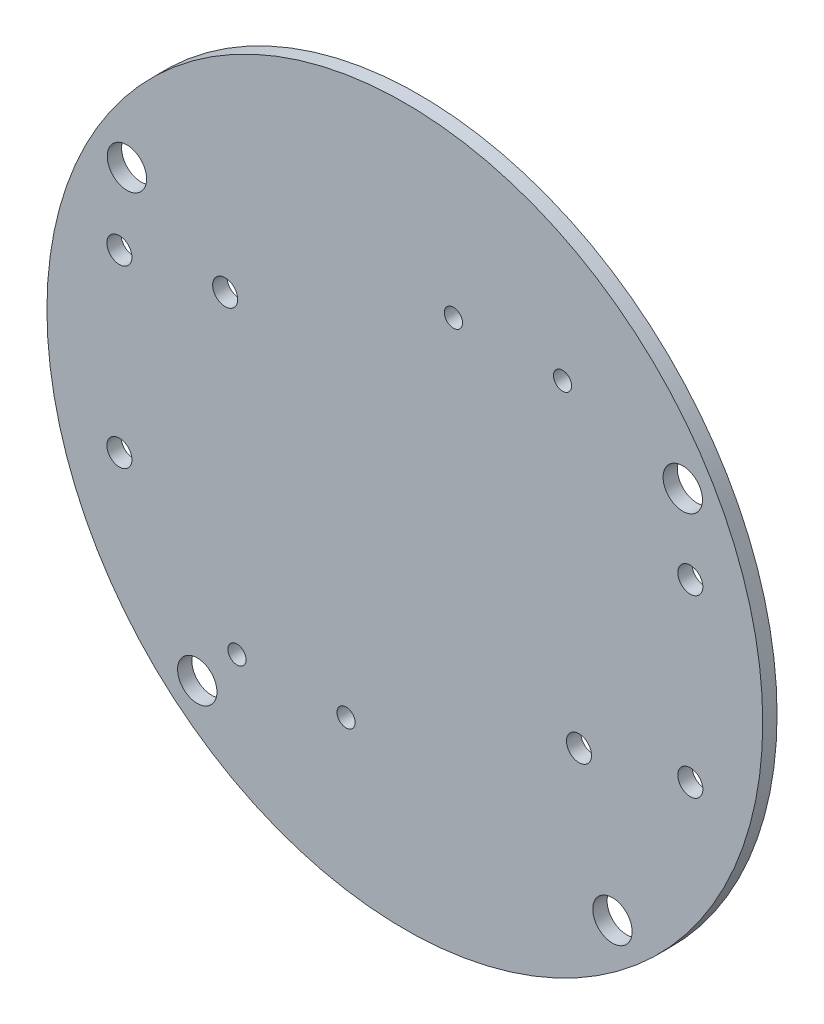
ISO-10303-21;
HEADER;
FILE_DESCRIPTION(('STEP AP214'),'2;1');
FILE_NAME('part.step','',(''),(''),'','','');
FILE_SCHEMA(('AUTOMOTIVE_DESIGN { 1 0 10303 214 1 1 1 1 }'));
ENDSEC;
DATA;
#1=APPLICATION_CONTEXT('core data for automotive mechanical design processes');
#2=APPLICATION_PROTOCOL_DEFINITION('international standard','automotive_design',2000,#1);
#3=PRODUCT_CONTEXT('',#1,'mechanical');
#4=PRODUCT('Part','Part','',(#3));
#5=PRODUCT_RELATED_PRODUCT_CATEGORY('part','',(#4));
#6=PRODUCT_DEFINITION_FORMATION('','',#4);
#7=PRODUCT_DEFINITION_CONTEXT('part definition',#1,'design');
#8=PRODUCT_DEFINITION('design','',#6,#7);
#9=PRODUCT_DEFINITION_SHAPE('','',#8);
#10=(LENGTH_UNIT() NAMED_UNIT(*) SI_UNIT(.MILLI.,.METRE.));
#11=(NAMED_UNIT(*) PLANE_ANGLE_UNIT() SI_UNIT($,.RADIAN.));
#12=(NAMED_UNIT(*) SI_UNIT($,.STERADIAN.) SOLID_ANGLE_UNIT());
#13=UNCERTAINTY_MEASURE_WITH_UNIT(LENGTH_MEASURE(1.E-05),#10,'distance_accuracy_value','');
#14=(GEOMETRIC_REPRESENTATION_CONTEXT(3) GLOBAL_UNCERTAINTY_ASSIGNED_CONTEXT((#13)) GLOBAL_UNIT_ASSIGNED_CONTEXT((#10,
#11,#12)) REPRESENTATION_CONTEXT('',''));
#15=CARTESIAN_POINT('',(0.,0.,0.));
#16=DIRECTION('',(0.,0.,1.));
#17=DIRECTION('',(1.,0.,0.));
#18=AXIS2_PLACEMENT_3D('',#15,#16,#17);
#19=CARTESIAN_POINT('',(0.,0.,2.));
#20=DIRECTION('',(0.,0.,-1.));
#21=DIRECTION('',(-1.,0.,0.));
#22=AXIS2_PLACEMENT_3D('',#19,#20,#21);
#23=CYLINDRICAL_SURFACE('',#22,50.);
#24=CARTESIAN_POINT('',(0.,0.,2.));
#25=DIRECTION('',(0.,0.,1.));
#26=DIRECTION('',(1.,0.,0.));
#27=AXIS2_PLACEMENT_3D('',#24,#25,#26);
#28=CIRCLE('',#27,50.);
#29=CARTESIAN_POINT('',(50.,0.,2.));
#30=VERTEX_POINT('',#29);
#31=EDGE_CURVE('E10',#30,#30,#28,.T.);
#32=ORIENTED_EDGE('',*,*,#31,.F.);
#33=EDGE_LOOP('',(#32));
#34=FACE_BOUND('',#33,.T.);
#35=CARTESIAN_POINT('',(0.,0.,0.));
#36=DIRECTION('',(0.,0.,1.));
#37=DIRECTION('',(1.,0.,0.));
#38=AXIS2_PLACEMENT_3D('',#35,#36,#37);
#39=CIRCLE('',#38,50.);
#40=CARTESIAN_POINT('',(50.,0.,0.));
#41=VERTEX_POINT('',#40);
#42=EDGE_CURVE('E47',#41,#41,#39,.T.);
#43=ORIENTED_EDGE('',*,*,#42,.T.);
#44=EDGE_LOOP('',(#43));
#45=FACE_BOUND('',#44,.T.);
#46=ADVANCED_FACE('F39',(#34,#45),#23,.T.);
#47=CARTESIAN_POINT('',(0.,0.,2.));
#48=DIRECTION('',(0.,0.,1.));
#49=DIRECTION('',(1.,0.,0.));
#50=AXIS2_PLACEMENT_3D('',#47,#48,#49);
#51=PLANE('',#50);
#52=CARTESIAN_POINT('',(39.88,-12.25,2.));
#53=DIRECTION('',(0.,0.,1.));
#54=DIRECTION('',(1.,0.,0.));
#55=AXIS2_PLACEMENT_3D('',#52,#53,#54);
#56=CIRCLE('',#55,1.75);
#57=CARTESIAN_POINT('',(41.63,-12.25,2.));
#58=VERTEX_POINT('',#57);
#59=EDGE_CURVE('E264',#58,#58,#56,.T.);
#60=ORIENTED_EDGE('',*,*,#59,.F.);
#61=EDGE_LOOP('',(#60));
#62=FACE_BOUND('',#61,.T.);
#63=CARTESIAN_POINT('',(6.79000000000002,27.4,2.));
#64=DIRECTION('',(0.,0.,1.));
#65=DIRECTION('',(1.,0.,0.));
#66=AXIS2_PLACEMENT_3D('',#63,#64,#65);
#67=CIRCLE('',#66,1.27);
#68=CARTESIAN_POINT('',(8.06000000000002,27.4,2.));
#69=VERTEX_POINT('',#68);
#70=EDGE_CURVE('E258',#69,#69,#67,.T.);
#71=ORIENTED_EDGE('',*,*,#70,.F.);
#72=EDGE_LOOP('',(#71));
#73=FACE_BOUND('',#72,.T.);
#74=CARTESIAN_POINT('',(22.03,27.4,2.));
#75=DIRECTION('',(0.,0.,1.));
#76=DIRECTION('',(1.,0.,0.));
#77=AXIS2_PLACEMENT_3D('',#74,#75,#76);
#78=CIRCLE('',#77,1.27);
#79=CARTESIAN_POINT('',(23.3,27.4,2.));
#80=VERTEX_POINT('',#79);
#81=EDGE_CURVE('E233',#80,#80,#78,.T.);
#82=ORIENTED_EDGE('',*,*,#81,.F.);
#83=EDGE_LOOP('',(#82));
#84=FACE_BOUND('',#83,.T.);
#85=CARTESIAN_POINT('',(-8.20999999999998,-28.46,2.));
#86=DIRECTION('',(0.,0.,1.));
#87=DIRECTION('',(1.,0.,0.));
#88=AXIS2_PLACEMENT_3D('',#85,#86,#87);
#89=CIRCLE('',#88,1.27);
#90=CARTESIAN_POINT('',(-6.93999999999998,-28.46,2.));
#91=VERTEX_POINT('',#90);
#92=EDGE_CURVE('E259',#91,#91,#89,.T.);
#93=ORIENTED_EDGE('',*,*,#92,.F.);
#94=EDGE_LOOP('',(#93));
#95=FACE_BOUND('',#94,.T.);
#96=CARTESIAN_POINT('',(39.88,12.25,2.));
#97=DIRECTION('',(0.,0.,1.));
#98=DIRECTION('',(1.,0.,0.));
#99=AXIS2_PLACEMENT_3D('',#96,#97,#98);
#100=CIRCLE('',#99,1.75);
#101=CARTESIAN_POINT('',(41.63,12.25,2.));
#102=VERTEX_POINT('',#101);
#103=EDGE_CURVE('E273',#102,#102,#100,.T.);
#104=ORIENTED_EDGE('',*,*,#103,.F.);
#105=EDGE_LOOP('',(#104));
#106=FACE_BOUND('',#105,.T.);
#107=CARTESIAN_POINT('',(-39.88,12.25,2.));
#108=DIRECTION('',(0.,0.,1.));
#109=DIRECTION('',(1.,0.,0.));
#110=AXIS2_PLACEMENT_3D('',#107,#108,#109);
#111=CIRCLE('',#110,1.75);
#112=CARTESIAN_POINT('',(-38.13,12.25,2.));
#113=VERTEX_POINT('',#112);
#114=EDGE_CURVE('E283',#113,#113,#111,.T.);
#115=ORIENTED_EDGE('',*,*,#114,.F.);
#116=EDGE_LOOP('',(#115));
#117=FACE_BOUND('',#116,.T.);
#118=CARTESIAN_POINT('',(-39.88,-12.25,2.));
#119=DIRECTION('',(0.,0.,1.));
#120=DIRECTION('',(1.,0.,0.));
#121=AXIS2_PLACEMENT_3D('',#118,#119,#120);
#122=CIRCLE('',#121,1.75);
#123=CARTESIAN_POINT('',(-38.13,-12.25,2.));
#124=VERTEX_POINT('',#123);
#125=EDGE_CURVE('E279',#124,#124,#122,.T.);
#126=ORIENTED_EDGE('',*,*,#125,.F.);
#127=EDGE_LOOP('',(#126));
#128=FACE_BOUND('',#127,.T.);
#129=CARTESIAN_POINT('',(24.33,-15.91,2.));
#130=DIRECTION('',(0.,0.,1.));
#131=DIRECTION('',(1.,0.,0.));
#132=AXIS2_PLACEMENT_3D('',#129,#130,#131);
#133=CIRCLE('',#132,1.75);
#134=CARTESIAN_POINT('',(26.08,-15.91,2.));
#135=VERTEX_POINT('',#134);
#136=EDGE_CURVE('E275',#135,#135,#133,.T.);
#137=ORIENTED_EDGE('',*,*,#136,.F.);
#138=EDGE_LOOP('',(#137));
#139=FACE_BOUND('',#138,.T.);
#140=CARTESIAN_POINT('',(-23.45,-28.46,2.));
#141=DIRECTION('',(0.,0.,1.));
#142=DIRECTION('',(1.,0.,0.));
#143=AXIS2_PLACEMENT_3D('',#140,#141,#142);
#144=CIRCLE('',#143,1.27);
#145=CARTESIAN_POINT('',(-22.18,-28.46,2.));
#146=VERTEX_POINT('',#145);
#147=EDGE_CURVE('E267',#146,#146,#144,.T.);
#148=ORIENTED_EDGE('',*,*,#147,.F.);
#149=EDGE_LOOP('',(#148));
#150=FACE_BOUND('',#149,.T.);
#151=CARTESIAN_POINT('',(-25.1,14.54,2.));
#152=DIRECTION('',(0.,0.,1.));
#153=DIRECTION('',(1.,0.,0.));
#154=AXIS2_PLACEMENT_3D('',#151,#152,#153);
#155=CIRCLE('',#154,1.75);
#156=CARTESIAN_POINT('',(-23.35,14.54,2.));
#157=VERTEX_POINT('',#156);
#158=EDGE_CURVE('E64',#157,#157,#155,.T.);
#159=ORIENTED_EDGE('',*,*,#158,.F.);
#160=EDGE_LOOP('',(#159));
#161=FACE_BOUND('',#160,.T.);
#162=CARTESIAN_POINT('',(38.8241975308642,22.7526193235952,2.));
#163=DIRECTION('',(0.,0.,1.));
#164=DIRECTION('',(1.,0.,0.));
#165=AXIS2_PLACEMENT_3D('',#162,#163,#164);
#166=CIRCLE('',#165,2.75);
#167=CARTESIAN_POINT('',(41.5741975308642,22.7526193235952,2.));
#168=VERTEX_POINT('',#167);
#169=EDGE_CURVE('E98',#168,#168,#166,.T.);
#170=ORIENTED_EDGE('',*,*,#169,.F.);
#171=EDGE_LOOP('',(#170));
#172=FACE_BOUND('',#171,.T.);
#173=CARTESIAN_POINT('',(-38.8241975308642,22.7526193235952,2.));
#174=DIRECTION('',(0.,0.,1.));
#175=DIRECTION('',(1.,0.,0.));
#176=AXIS2_PLACEMENT_3D('',#173,#174,#175);
#177=CIRCLE('',#176,2.75);
#178=CARTESIAN_POINT('',(-36.0741975308642,22.7526193235952,2.));
#179=VERTEX_POINT('',#178);
#180=EDGE_CURVE('E109',#179,#179,#177,.T.);
#181=ORIENTED_EDGE('',*,*,#180,.F.);
#182=EDGE_LOOP('',(#181));
#183=FACE_BOUND('',#182,.T.);
#184=CARTESIAN_POINT('',(29.,-34.4093010681705,2.));
#185=DIRECTION('',(0.,0.,1.));
#186=DIRECTION('',(1.,0.,0.));
#187=AXIS2_PLACEMENT_3D('',#184,#185,#186);
#188=CIRCLE('',#187,2.75);
#189=CARTESIAN_POINT('',(31.75,-34.4093010681705,2.));
#190=VERTEX_POINT('',#189);
#191=EDGE_CURVE('E123',#190,#190,#188,.T.);
#192=ORIENTED_EDGE('',*,*,#191,.F.);
#193=EDGE_LOOP('',(#192));
#194=FACE_BOUND('',#193,.T.);
#195=CARTESIAN_POINT('',(-29.,-34.4093010681705,2.));
#196=DIRECTION('',(0.,0.,1.));
#197=DIRECTION('',(1.,0.,0.));
#198=AXIS2_PLACEMENT_3D('',#195,#196,#197);
#199=CIRCLE('',#198,2.75);
#200=CARTESIAN_POINT('',(-26.25,-34.4093010681705,2.));
#201=VERTEX_POINT('',#200);
#202=EDGE_CURVE('E56',#201,#201,#199,.T.);
#203=ORIENTED_EDGE('',*,*,#202,.F.);
#204=EDGE_LOOP('',(#203));
#205=FACE_BOUND('',#204,.T.);
#206=ORIENTED_EDGE('',*,*,#31,.T.);
#207=EDGE_LOOP('',(#206));
#208=FACE_BOUND('',#207,.T.);
#209=ADVANCED_FACE('F142',(#62,#73,#84,#95,#106,#117,#128,#139,#150,#161,#172,#183,#194,#205,
#208),#51,.T.);
#210=CARTESIAN_POINT('',(0.,0.,0.));
#211=DIRECTION('',(0.,0.,1.));
#212=DIRECTION('',(1.,0.,0.));
#213=AXIS2_PLACEMENT_3D('',#210,#211,#212);
#214=PLANE('',#213);
#215=CARTESIAN_POINT('',(39.88,-12.25,0.));
#216=DIRECTION('',(0.,0.,1.));
#217=DIRECTION('',(1.,0.,0.));
#218=AXIS2_PLACEMENT_3D('',#215,#216,#217);
#219=CIRCLE('',#218,1.75);
#220=CARTESIAN_POINT('',(41.63,-12.25,0.));
#221=VERTEX_POINT('',#220);
#222=EDGE_CURVE('E42',#221,#221,#219,.T.);
#223=ORIENTED_EDGE('',*,*,#222,.T.);
#224=EDGE_LOOP('',(#223));
#225=FACE_BOUND('',#224,.T.);
#226=CARTESIAN_POINT('',(6.79000000000002,27.4,0.));
#227=DIRECTION('',(0.,0.,1.));
#228=DIRECTION('',(1.,0.,0.));
#229=AXIS2_PLACEMENT_3D('',#226,#227,#228);
#230=CIRCLE('',#229,1.27);
#231=CARTESIAN_POINT('',(8.06000000000002,27.4,0.));
#232=VERTEX_POINT('',#231);
#233=EDGE_CURVE('E91',#232,#232,#230,.T.);
#234=ORIENTED_EDGE('',*,*,#233,.T.);
#235=EDGE_LOOP('',(#234));
#236=FACE_BOUND('',#235,.T.);
#237=CARTESIAN_POINT('',(22.03,27.4,0.));
#238=DIRECTION('',(0.,0.,1.));
#239=DIRECTION('',(1.,0.,0.));
#240=AXIS2_PLACEMENT_3D('',#237,#238,#239);
#241=CIRCLE('',#240,1.27);
#242=CARTESIAN_POINT('',(23.3,27.4,0.));
#243=VERTEX_POINT('',#242);
#244=EDGE_CURVE('E88',#243,#243,#241,.T.);
#245=ORIENTED_EDGE('',*,*,#244,.T.);
#246=EDGE_LOOP('',(#245));
#247=FACE_BOUND('',#246,.T.);
#248=CARTESIAN_POINT('',(-8.20999999999998,-28.46,0.));
#249=DIRECTION('',(0.,0.,1.));
#250=DIRECTION('',(1.,0.,0.));
#251=AXIS2_PLACEMENT_3D('',#248,#249,#250);
#252=CIRCLE('',#251,1.27);
#253=CARTESIAN_POINT('',(-6.93999999999998,-28.46,0.));
#254=VERTEX_POINT('',#253);
#255=EDGE_CURVE('E84',#254,#254,#252,.T.);
#256=ORIENTED_EDGE('',*,*,#255,.T.);
#257=EDGE_LOOP('',(#256));
#258=FACE_BOUND('',#257,.T.);
#259=CARTESIAN_POINT('',(39.88,12.25,0.));
#260=DIRECTION('',(0.,0.,1.));
#261=DIRECTION('',(1.,0.,0.));
#262=AXIS2_PLACEMENT_3D('',#259,#260,#261);
#263=CIRCLE('',#262,1.75);
#264=CARTESIAN_POINT('',(41.63,12.25,0.));
#265=VERTEX_POINT('',#264);
#266=EDGE_CURVE('E80',#265,#265,#263,.T.);
#267=ORIENTED_EDGE('',*,*,#266,.T.);
#268=EDGE_LOOP('',(#267));
#269=FACE_BOUND('',#268,.T.);
#270=CARTESIAN_POINT('',(-39.88,12.25,0.));
#271=DIRECTION('',(0.,0.,1.));
#272=DIRECTION('',(1.,0.,0.));
#273=AXIS2_PLACEMENT_3D('',#270,#271,#272);
#274=CIRCLE('',#273,1.75);
#275=CARTESIAN_POINT('',(-38.13,12.25,0.));
#276=VERTEX_POINT('',#275);
#277=EDGE_CURVE('E76',#276,#276,#274,.T.);
#278=ORIENTED_EDGE('',*,*,#277,.T.);
#279=EDGE_LOOP('',(#278));
#280=FACE_BOUND('',#279,.T.);
#281=CARTESIAN_POINT('',(-39.88,-12.25,0.));
#282=DIRECTION('',(0.,0.,1.));
#283=DIRECTION('',(1.,0.,0.));
#284=AXIS2_PLACEMENT_3D('',#281,#282,#283);
#285=CIRCLE('',#284,1.75);
#286=CARTESIAN_POINT('',(-38.13,-12.25,0.));
#287=VERTEX_POINT('',#286);
#288=EDGE_CURVE('E72',#287,#287,#285,.T.);
#289=ORIENTED_EDGE('',*,*,#288,.T.);
#290=EDGE_LOOP('',(#289));
#291=FACE_BOUND('',#290,.T.);
#292=CARTESIAN_POINT('',(24.33,-15.91,0.));
#293=DIRECTION('',(0.,0.,1.));
#294=DIRECTION('',(1.,0.,0.));
#295=AXIS2_PLACEMENT_3D('',#292,#293,#294);
#296=CIRCLE('',#295,1.75);
#297=CARTESIAN_POINT('',(26.08,-15.91,0.));
#298=VERTEX_POINT('',#297);
#299=EDGE_CURVE('E68',#298,#298,#296,.T.);
#300=ORIENTED_EDGE('',*,*,#299,.T.);
#301=EDGE_LOOP('',(#300));
#302=FACE_BOUND('',#301,.T.);
#303=CARTESIAN_POINT('',(-23.45,-28.46,0.));
#304=DIRECTION('',(0.,0.,1.));
#305=DIRECTION('',(1.,0.,0.));
#306=AXIS2_PLACEMENT_3D('',#303,#304,#305);
#307=CIRCLE('',#306,1.27);
#308=CARTESIAN_POINT('',(-22.18,-28.46,0.));
#309=VERTEX_POINT('',#308);
#310=EDGE_CURVE('E63',#309,#309,#307,.T.);
#311=ORIENTED_EDGE('',*,*,#310,.T.);
#312=EDGE_LOOP('',(#311));
#313=FACE_BOUND('',#312,.T.);
#314=CARTESIAN_POINT('',(-25.1,14.54,0.));
#315=DIRECTION('',(0.,0.,1.));
#316=DIRECTION('',(1.,0.,0.));
#317=AXIS2_PLACEMENT_3D('',#314,#315,#316);
#318=CIRCLE('',#317,1.75);
#319=CARTESIAN_POINT('',(-23.35,14.54,0.));
#320=VERTEX_POINT('',#319);
#321=EDGE_CURVE('E59',#320,#320,#318,.T.);
#322=ORIENTED_EDGE('',*,*,#321,.T.);
#323=EDGE_LOOP('',(#322));
#324=FACE_BOUND('',#323,.T.);
#325=CARTESIAN_POINT('',(38.8241975308642,22.7526193235952,0.));
#326=DIRECTION('',(0.,0.,1.));
#327=DIRECTION('',(1.,0.,0.));
#328=AXIS2_PLACEMENT_3D('',#325,#326,#327);
#329=CIRCLE('',#328,2.75);
#330=CARTESIAN_POINT('',(41.5741975308642,22.7526193235952,0.));
#331=VERTEX_POINT('',#330);
#332=EDGE_CURVE('E103',#331,#331,#329,.T.);
#333=ORIENTED_EDGE('',*,*,#332,.T.);
#334=EDGE_LOOP('',(#333));
#335=FACE_BOUND('',#334,.T.);
#336=CARTESIAN_POINT('',(-38.8241975308642,22.7526193235952,0.));
#337=DIRECTION('',(0.,0.,1.));
#338=DIRECTION('',(1.,0.,0.));
#339=AXIS2_PLACEMENT_3D('',#336,#337,#338);
#340=CIRCLE('',#339,2.75);
#341=CARTESIAN_POINT('',(-36.0741975308642,22.7526193235952,0.));
#342=VERTEX_POINT('',#341);
#343=EDGE_CURVE('E129',#342,#342,#340,.T.);
#344=ORIENTED_EDGE('',*,*,#343,.T.);
#345=EDGE_LOOP('',(#344));
#346=FACE_BOUND('',#345,.T.);
#347=CARTESIAN_POINT('',(29.,-34.4093010681705,0.));
#348=DIRECTION('',(0.,0.,1.));
#349=DIRECTION('',(1.,0.,0.));
#350=AXIS2_PLACEMENT_3D('',#347,#348,#349);
#351=CIRCLE('',#350,2.75);
#352=CARTESIAN_POINT('',(31.75,-34.4093010681705,0.));
#353=VERTEX_POINT('',#352);
#354=EDGE_CURVE('E118',#353,#353,#351,.T.);
#355=ORIENTED_EDGE('',*,*,#354,.T.);
#356=EDGE_LOOP('',(#355));
#357=FACE_BOUND('',#356,.T.);
#358=CARTESIAN_POINT('',(-29.,-34.4093010681705,0.));
#359=DIRECTION('',(0.,0.,1.));
#360=DIRECTION('',(1.,0.,0.));
#361=AXIS2_PLACEMENT_3D('',#358,#359,#360);
#362=CIRCLE('',#361,2.75);
#363=CARTESIAN_POINT('',(-26.25,-34.4093010681705,0.));
#364=VERTEX_POINT('',#363);
#365=EDGE_CURVE('E53',#364,#364,#362,.T.);
#366=ORIENTED_EDGE('',*,*,#365,.T.);
#367=EDGE_LOOP('',(#366));
#368=FACE_BOUND('',#367,.T.);
#369=ORIENTED_EDGE('',*,*,#42,.F.);
#370=EDGE_LOOP('',(#369));
#371=FACE_BOUND('',#370,.T.);
#372=ADVANCED_FACE('F145',(#225,#236,#247,#258,#269,#280,#291,#302,#313,#324,#335,#346,#357,
#368,#371),#214,.F.);
#373=CARTESIAN_POINT('',(-29.,-34.4093010681705,0.));
#374=DIRECTION('',(0.,0.,1.));
#375=DIRECTION('',(1.,0.,0.));
#376=AXIS2_PLACEMENT_3D('',#373,#374,#375);
#377=CYLINDRICAL_SURFACE('',#376,2.75);
#378=ORIENTED_EDGE('',*,*,#365,.F.);
#379=EDGE_LOOP('',(#378));
#380=FACE_BOUND('',#379,.T.);
#381=ORIENTED_EDGE('',*,*,#202,.T.);
#382=EDGE_LOOP('',(#381));
#383=FACE_BOUND('',#382,.T.);
#384=ADVANCED_FACE('F153',(#380,#383),#377,.F.);
#385=CARTESIAN_POINT('',(29.,-34.4093010681705,0.));
#386=DIRECTION('',(0.,0.,1.));
#387=DIRECTION('',(1.,0.,0.));
#388=AXIS2_PLACEMENT_3D('',#385,#386,#387);
#389=CYLINDRICAL_SURFACE('',#388,2.75);
#390=ORIENTED_EDGE('',*,*,#354,.F.);
#391=EDGE_LOOP('',(#390));
#392=FACE_BOUND('',#391,.T.);
#393=ORIENTED_EDGE('',*,*,#191,.T.);
#394=EDGE_LOOP('',(#393));
#395=FACE_BOUND('',#394,.T.);
#396=ADVANCED_FACE('F151',(#392,#395),#389,.F.);
#397=CARTESIAN_POINT('',(-38.8241975308642,22.7526193235952,0.));
#398=DIRECTION('',(0.,0.,1.));
#399=DIRECTION('',(1.,0.,0.));
#400=AXIS2_PLACEMENT_3D('',#397,#398,#399);
#401=CYLINDRICAL_SURFACE('',#400,2.75);
#402=ORIENTED_EDGE('',*,*,#343,.F.);
#403=EDGE_LOOP('',(#402));
#404=FACE_BOUND('',#403,.T.);
#405=ORIENTED_EDGE('',*,*,#180,.T.);
#406=EDGE_LOOP('',(#405));
#407=FACE_BOUND('',#406,.T.);
#408=ADVANCED_FACE('F140',(#404,#407),#401,.F.);
#409=CARTESIAN_POINT('',(38.8241975308642,22.7526193235952,0.));
#410=DIRECTION('',(0.,0.,1.));
#411=DIRECTION('',(1.,0.,0.));
#412=AXIS2_PLACEMENT_3D('',#409,#410,#411);
#413=CYLINDRICAL_SURFACE('',#412,2.75);
#414=ORIENTED_EDGE('',*,*,#332,.F.);
#415=EDGE_LOOP('',(#414));
#416=FACE_BOUND('',#415,.T.);
#417=ORIENTED_EDGE('',*,*,#169,.T.);
#418=EDGE_LOOP('',(#417));
#419=FACE_BOUND('',#418,.T.);
#420=ADVANCED_FACE('F160',(#416,#419),#413,.F.);
#421=CARTESIAN_POINT('',(-25.1,14.54,-8.));
#422=DIRECTION('',(0.,0.,1.));
#423=DIRECTION('',(1.,0.,0.));
#424=AXIS2_PLACEMENT_3D('',#421,#422,#423);
#425=CYLINDRICAL_SURFACE('',#424,1.75);
#426=ORIENTED_EDGE('',*,*,#158,.T.);
#427=EDGE_LOOP('',(#426));
#428=FACE_BOUND('',#427,.T.);
#429=ORIENTED_EDGE('',*,*,#321,.F.);
#430=EDGE_LOOP('',(#429));
#431=FACE_BOUND('',#430,.T.);
#432=ADVANCED_FACE('F178',(#428,#431),#425,.F.);
#433=CARTESIAN_POINT('',(-23.45,-28.46,-8.));
#434=DIRECTION('',(0.,0.,1.));
#435=DIRECTION('',(1.,0.,0.));
#436=AXIS2_PLACEMENT_3D('',#433,#434,#435);
#437=CYLINDRICAL_SURFACE('',#436,1.27);
#438=ORIENTED_EDGE('',*,*,#147,.T.);
#439=EDGE_LOOP('',(#438));
#440=FACE_BOUND('',#439,.T.);
#441=ORIENTED_EDGE('',*,*,#310,.F.);
#442=EDGE_LOOP('',(#441));
#443=FACE_BOUND('',#442,.T.);
#444=ADVANCED_FACE('F183',(#440,#443),#437,.F.);
#445=CARTESIAN_POINT('',(24.33,-15.91,-8.));
#446=DIRECTION('',(0.,0.,1.));
#447=DIRECTION('',(1.,0.,0.));
#448=AXIS2_PLACEMENT_3D('',#445,#446,#447);
#449=CYLINDRICAL_SURFACE('',#448,1.75);
#450=ORIENTED_EDGE('',*,*,#136,.T.);
#451=EDGE_LOOP('',(#450));
#452=FACE_BOUND('',#451,.T.);
#453=ORIENTED_EDGE('',*,*,#299,.F.);
#454=EDGE_LOOP('',(#453));
#455=FACE_BOUND('',#454,.T.);
#456=ADVANCED_FACE('F192',(#452,#455),#449,.F.);
#457=CARTESIAN_POINT('',(-39.88,-12.25,-8.));
#458=DIRECTION('',(0.,0.,1.));
#459=DIRECTION('',(1.,0.,0.));
#460=AXIS2_PLACEMENT_3D('',#457,#458,#459);
#461=CYLINDRICAL_SURFACE('',#460,1.75);
#462=ORIENTED_EDGE('',*,*,#125,.T.);
#463=EDGE_LOOP('',(#462));
#464=FACE_BOUND('',#463,.T.);
#465=ORIENTED_EDGE('',*,*,#288,.F.);
#466=EDGE_LOOP('',(#465));
#467=FACE_BOUND('',#466,.T.);
#468=ADVANCED_FACE('F206',(#464,#467),#461,.F.);
#469=CARTESIAN_POINT('',(-39.88,12.25,-8.));
#470=DIRECTION('',(0.,0.,1.));
#471=DIRECTION('',(1.,0.,0.));
#472=AXIS2_PLACEMENT_3D('',#469,#470,#471);
#473=CYLINDRICAL_SURFACE('',#472,1.75);
#474=ORIENTED_EDGE('',*,*,#114,.T.);
#475=EDGE_LOOP('',(#474));
#476=FACE_BOUND('',#475,.T.);
#477=ORIENTED_EDGE('',*,*,#277,.F.);
#478=EDGE_LOOP('',(#477));
#479=FACE_BOUND('',#478,.T.);
#480=ADVANCED_FACE('F202',(#476,#479),#473,.F.);
#481=CARTESIAN_POINT('',(39.88,12.25,-8.));
#482=DIRECTION('',(0.,0.,1.));
#483=DIRECTION('',(1.,0.,0.));
#484=AXIS2_PLACEMENT_3D('',#481,#482,#483);
#485=CYLINDRICAL_SURFACE('',#484,1.75);
#486=ORIENTED_EDGE('',*,*,#103,.T.);
#487=EDGE_LOOP('',(#486));
#488=FACE_BOUND('',#487,.T.);
#489=ORIENTED_EDGE('',*,*,#266,.F.);
#490=EDGE_LOOP('',(#489));
#491=FACE_BOUND('',#490,.T.);
#492=ADVANCED_FACE('F198',(#488,#491),#485,.F.);
#493=CARTESIAN_POINT('',(-8.20999999999998,-28.46,-8.));
#494=DIRECTION('',(0.,0.,1.));
#495=DIRECTION('',(1.,0.,0.));
#496=AXIS2_PLACEMENT_3D('',#493,#494,#495);
#497=CYLINDRICAL_SURFACE('',#496,1.27);
#498=ORIENTED_EDGE('',*,*,#92,.T.);
#499=EDGE_LOOP('',(#498));
#500=FACE_BOUND('',#499,.T.);
#501=ORIENTED_EDGE('',*,*,#255,.F.);
#502=EDGE_LOOP('',(#501));
#503=FACE_BOUND('',#502,.T.);
#504=ADVANCED_FACE('F201',(#500,#503),#497,.F.);
#505=CARTESIAN_POINT('',(22.03,27.4,-8.));
#506=DIRECTION('',(0.,0.,1.));
#507=DIRECTION('',(1.,0.,0.));
#508=AXIS2_PLACEMENT_3D('',#505,#506,#507);
#509=CYLINDRICAL_SURFACE('',#508,1.27);
#510=ORIENTED_EDGE('',*,*,#81,.T.);
#511=EDGE_LOOP('',(#510));
#512=FACE_BOUND('',#511,.T.);
#513=ORIENTED_EDGE('',*,*,#244,.F.);
#514=EDGE_LOOP('',(#513));
#515=FACE_BOUND('',#514,.T.);
#516=ADVANCED_FACE('F218',(#512,#515),#509,.F.);
#517=CARTESIAN_POINT('',(6.79000000000002,27.4,-8.));
#518=DIRECTION('',(0.,0.,1.));
#519=DIRECTION('',(1.,0.,0.));
#520=AXIS2_PLACEMENT_3D('',#517,#518,#519);
#521=CYLINDRICAL_SURFACE('',#520,1.27);
#522=ORIENTED_EDGE('',*,*,#70,.T.);
#523=EDGE_LOOP('',(#522));
#524=FACE_BOUND('',#523,.T.);
#525=ORIENTED_EDGE('',*,*,#233,.F.);
#526=EDGE_LOOP('',(#525));
#527=FACE_BOUND('',#526,.T.);
#528=ADVANCED_FACE('F214',(#524,#527),#521,.F.);
#529=CARTESIAN_POINT('',(39.88,-12.25,-8.));
#530=DIRECTION('',(0.,0.,1.));
#531=DIRECTION('',(1.,0.,0.));
#532=AXIS2_PLACEMENT_3D('',#529,#530,#531);
#533=CYLINDRICAL_SURFACE('',#532,1.75);
#534=ORIENTED_EDGE('',*,*,#59,.T.);
#535=EDGE_LOOP('',(#534));
#536=FACE_BOUND('',#535,.T.);
#537=ORIENTED_EDGE('',*,*,#222,.F.);
#538=EDGE_LOOP('',(#537));
#539=FACE_BOUND('',#538,.T.);
#540=ADVANCED_FACE('F217',(#536,#539),#533,.F.);
#541=CLOSED_SHELL('',(#46,#209,#372,#384,#396,#408,#420,#432,#444,#456,#468,#480,#492,#504,#516,
#528,#540));
#542=MANIFOLD_SOLID_BREP('B2',#541);
#543=ADVANCED_BREP_SHAPE_REPRESENTATION('',(#18,#542),#14);
#544=SHAPE_DEFINITION_REPRESENTATION(#9,#543);
ENDSEC;
END-ISO-10303-21;
